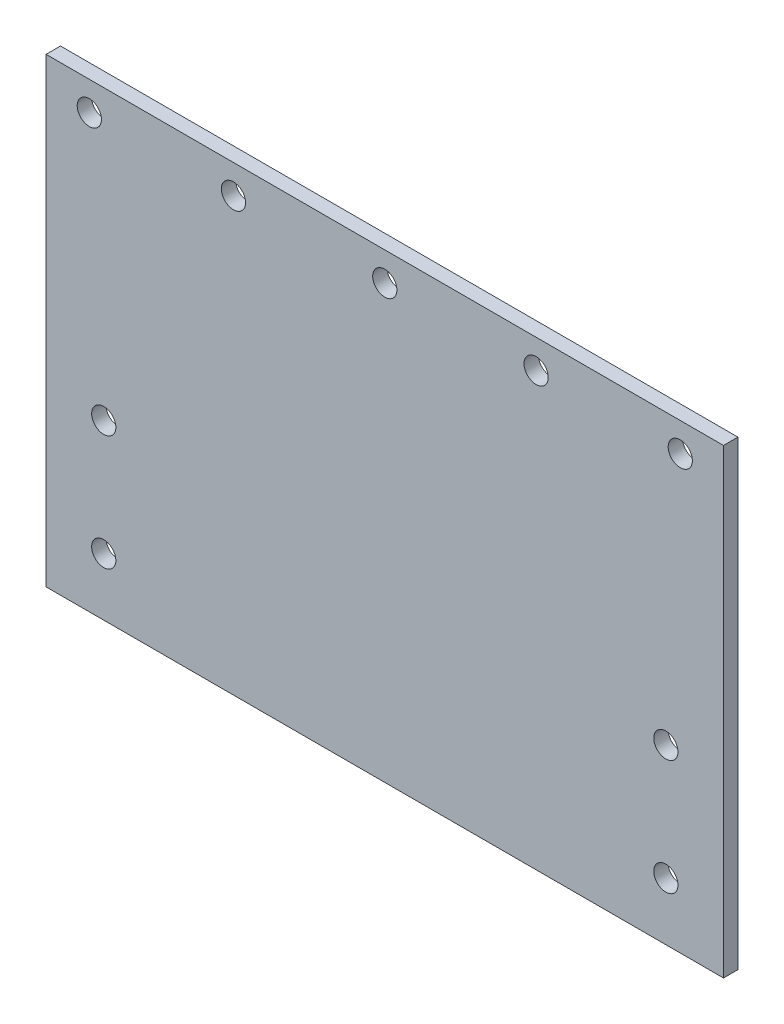
ISO-10303-21;
HEADER;
FILE_DESCRIPTION(('STEP AP214'),'2;1');
FILE_NAME('part.step','',(''),(''),'','','');
FILE_SCHEMA(('AUTOMOTIVE_DESIGN { 1 0 10303 214 1 1 1 1 }'));
ENDSEC;
DATA;
#1=APPLICATION_CONTEXT('core data for automotive mechanical design processes');
#2=APPLICATION_PROTOCOL_DEFINITION('international standard','automotive_design',2000,#1);
#3=PRODUCT_CONTEXT('',#1,'mechanical');
#4=PRODUCT('Part','Part','',(#3));
#5=PRODUCT_RELATED_PRODUCT_CATEGORY('part','',(#4));
#6=PRODUCT_DEFINITION_FORMATION('','',#4);
#7=PRODUCT_DEFINITION_CONTEXT('part definition',#1,'design');
#8=PRODUCT_DEFINITION('design','',#6,#7);
#9=PRODUCT_DEFINITION_SHAPE('','',#8);
#10=(LENGTH_UNIT() NAMED_UNIT(*) SI_UNIT(.MILLI.,.METRE.));
#11=(NAMED_UNIT(*) PLANE_ANGLE_UNIT() SI_UNIT($,.RADIAN.));
#12=(NAMED_UNIT(*) SI_UNIT($,.STERADIAN.) SOLID_ANGLE_UNIT());
#13=UNCERTAINTY_MEASURE_WITH_UNIT(LENGTH_MEASURE(1.E-05),#10,'distance_accuracy_value','');
#14=(GEOMETRIC_REPRESENTATION_CONTEXT(3) GLOBAL_UNCERTAINTY_ASSIGNED_CONTEXT((#13)) GLOBAL_UNIT_ASSIGNED_CONTEXT((#10,
#11,#12)) REPRESENTATION_CONTEXT('',''));
#15=CARTESIAN_POINT('',(0.,0.,0.));
#16=DIRECTION('',(0.,0.,1.));
#17=DIRECTION('',(1.,0.,0.));
#18=AXIS2_PLACEMENT_3D('',#15,#16,#17);
#19=CARTESIAN_POINT('',(-117.5,-80.,5.));
#20=DIRECTION('',(1.,0.,0.));
#21=DIRECTION('',(0.,0.,-1.));
#22=AXIS2_PLACEMENT_3D('',#19,#20,#21);
#23=PLANE('',#22);
#24=DIRECTION('',(0.,-1.,0.));
#25=VECTOR('',#24,1.);
#26=CARTESIAN_POINT('',(-117.5,-80.,0.));
#27=LINE('',#26,#25);
#28=CARTESIAN_POINT('',(-117.5,80.,0.));
#29=VERTEX_POINT('',#28);
#30=CARTESIAN_POINT('',(-117.5,-80.,0.));
#31=VERTEX_POINT('',#30);
#32=EDGE_CURVE('E111',#29,#31,#27,.T.);
#33=ORIENTED_EDGE('',*,*,#32,.T.);
#34=DIRECTION('',(0.,0.,-1.));
#35=VECTOR('',#34,1.);
#36=CARTESIAN_POINT('',(-117.5,-80.,5.));
#37=LINE('',#36,#35);
#38=CARTESIAN_POINT('',(-117.5,-80.,5.));
#39=VERTEX_POINT('',#38);
#40=EDGE_CURVE('E11',#39,#31,#37,.T.);
#41=ORIENTED_EDGE('',*,*,#40,.F.);
#42=DIRECTION('',(0.,-1.,0.));
#43=VECTOR('',#42,1.);
#44=CARTESIAN_POINT('',(-117.5,-80.,5.));
#45=LINE('',#44,#43);
#46=CARTESIAN_POINT('',(-117.5,80.,5.));
#47=VERTEX_POINT('',#46);
#48=EDGE_CURVE('E95',#47,#39,#45,.T.);
#49=ORIENTED_EDGE('',*,*,#48,.F.);
#50=DIRECTION('',(0.,0.,-1.));
#51=VECTOR('',#50,1.);
#52=CARTESIAN_POINT('',(-117.5,80.,5.));
#53=LINE('',#52,#51);
#54=EDGE_CURVE('E107',#47,#29,#53,.T.);
#55=ORIENTED_EDGE('',*,*,#54,.T.);
#56=EDGE_LOOP('',(#33,#41,#49,#55));
#57=FACE_BOUND('',#56,.T.);
#58=ADVANCED_FACE('F43',(#57),#23,.F.);
#59=CARTESIAN_POINT('',(117.5,-80.,5.));
#60=DIRECTION('',(0.,1.,0.));
#61=DIRECTION('',(-1.,0.,0.));
#62=AXIS2_PLACEMENT_3D('',#59,#60,#61);
#63=PLANE('',#62);
#64=DIRECTION('',(1.,0.,0.));
#65=VECTOR('',#64,1.);
#66=CARTESIAN_POINT('',(117.5,-80.,0.));
#67=LINE('',#66,#65);
#68=CARTESIAN_POINT('',(117.5,-80.,0.));
#69=VERTEX_POINT('',#68);
#70=EDGE_CURVE('E100',#31,#69,#67,.T.);
#71=ORIENTED_EDGE('',*,*,#70,.T.);
#72=DIRECTION('',(0.,0.,-1.));
#73=VECTOR('',#72,1.);
#74=CARTESIAN_POINT('',(117.5,-80.,5.));
#75=LINE('',#74,#73);
#76=CARTESIAN_POINT('',(117.5,-80.,5.));
#77=VERTEX_POINT('',#76);
#78=EDGE_CURVE('E52',#77,#69,#75,.T.);
#79=ORIENTED_EDGE('',*,*,#78,.F.);
#80=DIRECTION('',(1.,0.,0.));
#81=VECTOR('',#80,1.);
#82=CARTESIAN_POINT('',(117.5,-80.,5.));
#83=LINE('',#82,#81);
#84=EDGE_CURVE('E90',#39,#77,#83,.T.);
#85=ORIENTED_EDGE('',*,*,#84,.F.);
#86=ORIENTED_EDGE('',*,*,#40,.T.);
#87=EDGE_LOOP('',(#71,#79,#85,#86));
#88=FACE_BOUND('',#87,.T.);
#89=ADVANCED_FACE('F99',(#88),#63,.F.);
#90=CARTESIAN_POINT('',(117.5,-80.,5.));
#91=DIRECTION('',(-1.,0.,0.));
#92=DIRECTION('',(0.,0.,1.));
#93=AXIS2_PLACEMENT_3D('',#90,#91,#92);
#94=PLANE('',#93);
#95=DIRECTION('',(0.,1.,0.));
#96=VECTOR('',#95,1.);
#97=CARTESIAN_POINT('',(117.5,-80.,0.));
#98=LINE('',#97,#96);
#99=CARTESIAN_POINT('',(117.5,80.,0.));
#100=VERTEX_POINT('',#99);
#101=EDGE_CURVE('E77',#69,#100,#98,.T.);
#102=ORIENTED_EDGE('',*,*,#101,.T.);
#103=DIRECTION('',(0.,0.,-1.));
#104=VECTOR('',#103,1.);
#105=CARTESIAN_POINT('',(117.5,80.,5.));
#106=LINE('',#105,#104);
#107=CARTESIAN_POINT('',(117.5,80.,5.));
#108=VERTEX_POINT('',#107);
#109=EDGE_CURVE('E102',#108,#100,#106,.T.);
#110=ORIENTED_EDGE('',*,*,#109,.F.);
#111=DIRECTION('',(0.,1.,0.));
#112=VECTOR('',#111,1.);
#113=CARTESIAN_POINT('',(117.5,-80.,5.));
#114=LINE('',#113,#112);
#115=EDGE_CURVE('E93',#77,#108,#114,.T.);
#116=ORIENTED_EDGE('',*,*,#115,.F.);
#117=ORIENTED_EDGE('',*,*,#78,.T.);
#118=EDGE_LOOP('',(#102,#110,#116,#117));
#119=FACE_BOUND('',#118,.T.);
#120=ADVANCED_FACE('F103',(#119),#94,.F.);
#121=CARTESIAN_POINT('',(117.5,80.,5.));
#122=DIRECTION('',(0.,-1.,0.));
#123=DIRECTION('',(1.,0.,0.));
#124=AXIS2_PLACEMENT_3D('',#121,#122,#123);
#125=PLANE('',#124);
#126=DIRECTION('',(-1.,0.,0.));
#127=VECTOR('',#126,1.);
#128=CARTESIAN_POINT('',(117.5,80.,0.));
#129=LINE('',#128,#127);
#130=EDGE_CURVE('E83',#100,#29,#129,.T.);
#131=ORIENTED_EDGE('',*,*,#130,.T.);
#132=ORIENTED_EDGE('',*,*,#54,.F.);
#133=DIRECTION('',(-1.,0.,0.));
#134=VECTOR('',#133,1.);
#135=CARTESIAN_POINT('',(117.5,80.,5.));
#136=LINE('',#135,#134);
#137=EDGE_CURVE('E60',#108,#47,#136,.T.);
#138=ORIENTED_EDGE('',*,*,#137,.F.);
#139=ORIENTED_EDGE('',*,*,#109,.T.);
#140=EDGE_LOOP('',(#131,#132,#138,#139));
#141=FACE_BOUND('',#140,.T.);
#142=ADVANCED_FACE('F125',(#141),#125,.F.);
#143=CARTESIAN_POINT('',(0.,0.,5.));
#144=DIRECTION('',(0.,0.,1.));
#145=DIRECTION('',(1.,0.,0.));
#146=AXIS2_PLACEMENT_3D('',#143,#144,#145);
#147=PLANE('',#146);
#148=CARTESIAN_POINT('',(-102.5,70.,5.));
#149=DIRECTION('',(0.,0.,1.));
#150=DIRECTION('',(1.,0.,0.));
#151=AXIS2_PLACEMENT_3D('',#148,#149,#150);
#152=CIRCLE('',#151,4.19999999999998);
#153=CARTESIAN_POINT('',(-98.3,70.,5.));
#154=VERTEX_POINT('',#153);
#155=EDGE_CURVE('E199',#154,#154,#152,.T.);
#156=ORIENTED_EDGE('',*,*,#155,.F.);
#157=EDGE_LOOP('',(#156));
#158=FACE_BOUND('',#157,.T.);
#159=CARTESIAN_POINT('',(-97.5,-20.,5.));
#160=DIRECTION('',(0.,0.,1.));
#161=DIRECTION('',(1.,0.,0.));
#162=AXIS2_PLACEMENT_3D('',#159,#160,#161);
#163=CIRCLE('',#162,4.2);
#164=CARTESIAN_POINT('',(-93.3,-20.,5.));
#165=VERTEX_POINT('',#164);
#166=EDGE_CURVE('E191',#165,#165,#163,.T.);
#167=ORIENTED_EDGE('',*,*,#166,.F.);
#168=EDGE_LOOP('',(#167));
#169=FACE_BOUND('',#168,.T.);
#170=CARTESIAN_POINT('',(-97.5,-60.,5.));
#171=DIRECTION('',(0.,0.,1.));
#172=DIRECTION('',(1.,0.,0.));
#173=AXIS2_PLACEMENT_3D('',#170,#171,#172);
#174=CIRCLE('',#173,4.2);
#175=CARTESIAN_POINT('',(-93.3,-60.,5.));
#176=VERTEX_POINT('',#175);
#177=EDGE_CURVE('E183',#176,#176,#174,.T.);
#178=ORIENTED_EDGE('',*,*,#177,.F.);
#179=EDGE_LOOP('',(#178));
#180=FACE_BOUND('',#179,.T.);
#181=CARTESIAN_POINT('',(-52.5,70.,5.));
#182=DIRECTION('',(0.,0.,1.));
#183=DIRECTION('',(1.,0.,0.));
#184=AXIS2_PLACEMENT_3D('',#181,#182,#183);
#185=CIRCLE('',#184,4.19999999999999);
#186=CARTESIAN_POINT('',(-48.3,70.,5.));
#187=VERTEX_POINT('',#186);
#188=EDGE_CURVE('E175',#187,#187,#185,.T.);
#189=ORIENTED_EDGE('',*,*,#188,.F.);
#190=EDGE_LOOP('',(#189));
#191=FACE_BOUND('',#190,.T.);
#192=CARTESIAN_POINT('',(0.,70.,5.));
#193=DIRECTION('',(0.,0.,1.));
#194=DIRECTION('',(1.,0.,0.));
#195=AXIS2_PLACEMENT_3D('',#192,#193,#194);
#196=CIRCLE('',#195,4.19999999999999);
#197=CARTESIAN_POINT('',(4.19999999999999,70.,5.));
#198=VERTEX_POINT('',#197);
#199=EDGE_CURVE('E167',#198,#198,#196,.T.);
#200=ORIENTED_EDGE('',*,*,#199,.F.);
#201=EDGE_LOOP('',(#200));
#202=FACE_BOUND('',#201,.T.);
#203=CARTESIAN_POINT('',(52.5,70.,5.));
#204=DIRECTION('',(0.,0.,1.));
#205=DIRECTION('',(1.,0.,0.));
#206=AXIS2_PLACEMENT_3D('',#203,#204,#205);
#207=CIRCLE('',#206,4.19999999999999);
#208=CARTESIAN_POINT('',(56.7,70.,5.));
#209=VERTEX_POINT('',#208);
#210=EDGE_CURVE('E159',#209,#209,#207,.T.);
#211=ORIENTED_EDGE('',*,*,#210,.F.);
#212=EDGE_LOOP('',(#211));
#213=FACE_BOUND('',#212,.T.);
#214=CARTESIAN_POINT('',(102.5,70.,5.));
#215=DIRECTION('',(0.,0.,1.));
#216=DIRECTION('',(1.,0.,0.));
#217=AXIS2_PLACEMENT_3D('',#214,#215,#216);
#218=CIRCLE('',#217,4.19999999999998);
#219=CARTESIAN_POINT('',(106.7,70.,5.));
#220=VERTEX_POINT('',#219);
#221=EDGE_CURVE('E151',#220,#220,#218,.T.);
#222=ORIENTED_EDGE('',*,*,#221,.F.);
#223=EDGE_LOOP('',(#222));
#224=FACE_BOUND('',#223,.T.);
#225=CARTESIAN_POINT('',(97.5,-20.,5.));
#226=DIRECTION('',(0.,0.,1.));
#227=DIRECTION('',(1.,0.,0.));
#228=AXIS2_PLACEMENT_3D('',#225,#226,#227);
#229=CIRCLE('',#228,4.2);
#230=CARTESIAN_POINT('',(101.7,-20.,5.));
#231=VERTEX_POINT('',#230);
#232=EDGE_CURVE('E143',#231,#231,#229,.T.);
#233=ORIENTED_EDGE('',*,*,#232,.F.);
#234=EDGE_LOOP('',(#233));
#235=FACE_BOUND('',#234,.T.);
#236=CARTESIAN_POINT('',(97.5,-60.,5.));
#237=DIRECTION('',(0.,0.,1.));
#238=DIRECTION('',(1.,0.,0.));
#239=AXIS2_PLACEMENT_3D('',#236,#237,#238);
#240=CIRCLE('',#239,4.2);
#241=CARTESIAN_POINT('',(101.7,-60.,5.));
#242=VERTEX_POINT('',#241);
#243=EDGE_CURVE('E135',#242,#242,#240,.T.);
#244=ORIENTED_EDGE('',*,*,#243,.F.);
#245=EDGE_LOOP('',(#244));
#246=FACE_BOUND('',#245,.T.);
#247=ORIENTED_EDGE('',*,*,#48,.T.);
#248=ORIENTED_EDGE('',*,*,#84,.T.);
#249=ORIENTED_EDGE('',*,*,#115,.T.);
#250=ORIENTED_EDGE('',*,*,#137,.T.);
#251=EDGE_LOOP('',(#247,#248,#249,#250));
#252=FACE_BOUND('',#251,.T.);
#253=ADVANCED_FACE('F91',(#158,#169,#180,#191,#202,#213,#224,#235,#246,#252),#147,.T.);
#254=CARTESIAN_POINT('',(0.,0.,0.));
#255=DIRECTION('',(0.,0.,1.));
#256=DIRECTION('',(1.,0.,0.));
#257=AXIS2_PLACEMENT_3D('',#254,#255,#256);
#258=PLANE('',#257);
#259=CARTESIAN_POINT('',(-102.5,70.,0.));
#260=DIRECTION('',(0.,0.,1.));
#261=DIRECTION('',(1.,0.,0.));
#262=AXIS2_PLACEMENT_3D('',#259,#260,#261);
#263=CIRCLE('',#262,4.2);
#264=CARTESIAN_POINT('',(-98.3,70.,0.));
#265=VERTEX_POINT('',#264);
#266=EDGE_CURVE('E195',#265,#265,#263,.T.);
#267=ORIENTED_EDGE('',*,*,#266,.T.);
#268=EDGE_LOOP('',(#267));
#269=FACE_BOUND('',#268,.T.);
#270=CARTESIAN_POINT('',(-97.5,-20.,0.));
#271=DIRECTION('',(0.,0.,1.));
#272=DIRECTION('',(1.,0.,0.));
#273=AXIS2_PLACEMENT_3D('',#270,#271,#272);
#274=CIRCLE('',#273,4.2);
#275=CARTESIAN_POINT('',(-93.3,-20.,0.));
#276=VERTEX_POINT('',#275);
#277=EDGE_CURVE('E187',#276,#276,#274,.T.);
#278=ORIENTED_EDGE('',*,*,#277,.T.);
#279=EDGE_LOOP('',(#278));
#280=FACE_BOUND('',#279,.T.);
#281=CARTESIAN_POINT('',(-97.5,-60.,0.));
#282=DIRECTION('',(0.,0.,1.));
#283=DIRECTION('',(1.,0.,0.));
#284=AXIS2_PLACEMENT_3D('',#281,#282,#283);
#285=CIRCLE('',#284,4.2);
#286=CARTESIAN_POINT('',(-93.3,-60.,0.));
#287=VERTEX_POINT('',#286);
#288=EDGE_CURVE('E179',#287,#287,#285,.T.);
#289=ORIENTED_EDGE('',*,*,#288,.T.);
#290=EDGE_LOOP('',(#289));
#291=FACE_BOUND('',#290,.T.);
#292=CARTESIAN_POINT('',(-52.5,70.,0.));
#293=DIRECTION('',(0.,0.,1.));
#294=DIRECTION('',(1.,0.,0.));
#295=AXIS2_PLACEMENT_3D('',#292,#293,#294);
#296=CIRCLE('',#295,4.2);
#297=CARTESIAN_POINT('',(-48.3,70.,0.));
#298=VERTEX_POINT('',#297);
#299=EDGE_CURVE('E171',#298,#298,#296,.T.);
#300=ORIENTED_EDGE('',*,*,#299,.T.);
#301=EDGE_LOOP('',(#300));
#302=FACE_BOUND('',#301,.T.);
#303=CARTESIAN_POINT('',(0.,70.,0.));
#304=DIRECTION('',(0.,0.,1.));
#305=DIRECTION('',(1.,0.,0.));
#306=AXIS2_PLACEMENT_3D('',#303,#304,#305);
#307=CIRCLE('',#306,4.2);
#308=CARTESIAN_POINT('',(4.2,70.,0.));
#309=VERTEX_POINT('',#308);
#310=EDGE_CURVE('E163',#309,#309,#307,.T.);
#311=ORIENTED_EDGE('',*,*,#310,.T.);
#312=EDGE_LOOP('',(#311));
#313=FACE_BOUND('',#312,.T.);
#314=CARTESIAN_POINT('',(52.5,70.,0.));
#315=DIRECTION('',(0.,0.,1.));
#316=DIRECTION('',(1.,0.,0.));
#317=AXIS2_PLACEMENT_3D('',#314,#315,#316);
#318=CIRCLE('',#317,4.2);
#319=CARTESIAN_POINT('',(56.7,70.,0.));
#320=VERTEX_POINT('',#319);
#321=EDGE_CURVE('E155',#320,#320,#318,.T.);
#322=ORIENTED_EDGE('',*,*,#321,.T.);
#323=EDGE_LOOP('',(#322));
#324=FACE_BOUND('',#323,.T.);
#325=CARTESIAN_POINT('',(102.5,70.,0.));
#326=DIRECTION('',(0.,0.,1.));
#327=DIRECTION('',(1.,0.,0.));
#328=AXIS2_PLACEMENT_3D('',#325,#326,#327);
#329=CIRCLE('',#328,4.2);
#330=CARTESIAN_POINT('',(106.7,70.,0.));
#331=VERTEX_POINT('',#330);
#332=EDGE_CURVE('E147',#331,#331,#329,.T.);
#333=ORIENTED_EDGE('',*,*,#332,.T.);
#334=EDGE_LOOP('',(#333));
#335=FACE_BOUND('',#334,.T.);
#336=CARTESIAN_POINT('',(97.5,-20.,0.));
#337=DIRECTION('',(0.,0.,1.));
#338=DIRECTION('',(1.,0.,0.));
#339=AXIS2_PLACEMENT_3D('',#336,#337,#338);
#340=CIRCLE('',#339,4.2);
#341=CARTESIAN_POINT('',(101.7,-20.,0.));
#342=VERTEX_POINT('',#341);
#343=EDGE_CURVE('E139',#342,#342,#340,.T.);
#344=ORIENTED_EDGE('',*,*,#343,.T.);
#345=EDGE_LOOP('',(#344));
#346=FACE_BOUND('',#345,.T.);
#347=CARTESIAN_POINT('',(97.5,-60.,0.));
#348=DIRECTION('',(0.,0.,1.));
#349=DIRECTION('',(1.,0.,0.));
#350=AXIS2_PLACEMENT_3D('',#347,#348,#349);
#351=CIRCLE('',#350,4.2);
#352=CARTESIAN_POINT('',(101.7,-60.,0.));
#353=VERTEX_POINT('',#352);
#354=EDGE_CURVE('E115',#353,#353,#351,.T.);
#355=ORIENTED_EDGE('',*,*,#354,.T.);
#356=EDGE_LOOP('',(#355));
#357=FACE_BOUND('',#356,.T.);
#358=ORIENTED_EDGE('',*,*,#32,.F.);
#359=ORIENTED_EDGE('',*,*,#130,.F.);
#360=ORIENTED_EDGE('',*,*,#101,.F.);
#361=ORIENTED_EDGE('',*,*,#70,.F.);
#362=EDGE_LOOP('',(#358,#359,#360,#361));
#363=FACE_BOUND('',#362,.T.);
#364=ADVANCED_FACE('F128',(#269,#280,#291,#302,#313,#324,#335,#346,#357,#363),#258,.F.);
#365=CARTESIAN_POINT('',(97.5,-60.,5.));
#366=DIRECTION('',(0.,0.,1.));
#367=DIRECTION('',(1.,0.,0.));
#368=AXIS2_PLACEMENT_3D('',#365,#366,#367);
#369=CYLINDRICAL_SURFACE('',#368,4.2);
#370=ORIENTED_EDGE('',*,*,#354,.F.);
#371=EDGE_LOOP('',(#370));
#372=FACE_BOUND('',#371,.T.);
#373=ORIENTED_EDGE('',*,*,#243,.T.);
#374=EDGE_LOOP('',(#373));
#375=FACE_BOUND('',#374,.T.);
#376=ADVANCED_FACE('F225',(#372,#375),#369,.F.);
#377=CARTESIAN_POINT('',(97.5,-20.,5.));
#378=DIRECTION('',(0.,0.,1.));
#379=DIRECTION('',(1.,0.,0.));
#380=AXIS2_PLACEMENT_3D('',#377,#378,#379);
#381=CYLINDRICAL_SURFACE('',#380,4.2);
#382=ORIENTED_EDGE('',*,*,#343,.F.);
#383=EDGE_LOOP('',(#382));
#384=FACE_BOUND('',#383,.T.);
#385=ORIENTED_EDGE('',*,*,#232,.T.);
#386=EDGE_LOOP('',(#385));
#387=FACE_BOUND('',#386,.T.);
#388=ADVANCED_FACE('F227',(#384,#387),#381,.F.);
#389=CARTESIAN_POINT('',(102.5,70.,5.));
#390=DIRECTION('',(0.,0.,1.));
#391=DIRECTION('',(1.,0.,0.));
#392=AXIS2_PLACEMENT_3D('',#389,#390,#391);
#393=CYLINDRICAL_SURFACE('',#392,4.19999999999999);
#394=ORIENTED_EDGE('',*,*,#332,.F.);
#395=EDGE_LOOP('',(#394));
#396=FACE_BOUND('',#395,.T.);
#397=ORIENTED_EDGE('',*,*,#221,.T.);
#398=EDGE_LOOP('',(#397));
#399=FACE_BOUND('',#398,.T.);
#400=ADVANCED_FACE('F234',(#396,#399),#393,.F.);
#401=CARTESIAN_POINT('',(52.5,70.,5.));
#402=DIRECTION('',(0.,0.,1.));
#403=DIRECTION('',(1.,0.,0.));
#404=AXIS2_PLACEMENT_3D('',#401,#402,#403);
#405=CYLINDRICAL_SURFACE('',#404,4.19999999999999);
#406=ORIENTED_EDGE('',*,*,#321,.F.);
#407=EDGE_LOOP('',(#406));
#408=FACE_BOUND('',#407,.T.);
#409=ORIENTED_EDGE('',*,*,#210,.T.);
#410=EDGE_LOOP('',(#409));
#411=FACE_BOUND('',#410,.T.);
#412=ADVANCED_FACE('F284',(#408,#411),#405,.F.);
#413=CARTESIAN_POINT('',(0.,70.,5.));
#414=DIRECTION('',(0.,0.,1.));
#415=DIRECTION('',(1.,0.,0.));
#416=AXIS2_PLACEMENT_3D('',#413,#414,#415);
#417=CYLINDRICAL_SURFACE('',#416,4.19999999999999);
#418=ORIENTED_EDGE('',*,*,#310,.F.);
#419=EDGE_LOOP('',(#418));
#420=FACE_BOUND('',#419,.T.);
#421=ORIENTED_EDGE('',*,*,#199,.T.);
#422=EDGE_LOOP('',(#421));
#423=FACE_BOUND('',#422,.T.);
#424=ADVANCED_FACE('F295',(#420,#423),#417,.F.);
#425=CARTESIAN_POINT('',(-52.5,70.,5.));
#426=DIRECTION('',(0.,0.,1.));
#427=DIRECTION('',(1.,0.,0.));
#428=AXIS2_PLACEMENT_3D('',#425,#426,#427);
#429=CYLINDRICAL_SURFACE('',#428,4.19999999999999);
#430=ORIENTED_EDGE('',*,*,#299,.F.);
#431=EDGE_LOOP('',(#430));
#432=FACE_BOUND('',#431,.T.);
#433=ORIENTED_EDGE('',*,*,#188,.T.);
#434=EDGE_LOOP('',(#433));
#435=FACE_BOUND('',#434,.T.);
#436=ADVANCED_FACE('F306',(#432,#435),#429,.F.);
#437=CARTESIAN_POINT('',(-97.5,-60.,5.));
#438=DIRECTION('',(0.,0.,1.));
#439=DIRECTION('',(1.,0.,0.));
#440=AXIS2_PLACEMENT_3D('',#437,#438,#439);
#441=CYLINDRICAL_SURFACE('',#440,4.2);
#442=ORIENTED_EDGE('',*,*,#288,.F.);
#443=EDGE_LOOP('',(#442));
#444=FACE_BOUND('',#443,.T.);
#445=ORIENTED_EDGE('',*,*,#177,.T.);
#446=EDGE_LOOP('',(#445));
#447=FACE_BOUND('',#446,.T.);
#448=ADVANCED_FACE('F317',(#444,#447),#441,.F.);
#449=CARTESIAN_POINT('',(-97.5,-20.,5.));
#450=DIRECTION('',(0.,0.,1.));
#451=DIRECTION('',(1.,0.,0.));
#452=AXIS2_PLACEMENT_3D('',#449,#450,#451);
#453=CYLINDRICAL_SURFACE('',#452,4.2);
#454=ORIENTED_EDGE('',*,*,#277,.F.);
#455=EDGE_LOOP('',(#454));
#456=FACE_BOUND('',#455,.T.);
#457=ORIENTED_EDGE('',*,*,#166,.T.);
#458=EDGE_LOOP('',(#457));
#459=FACE_BOUND('',#458,.T.);
#460=ADVANCED_FACE('F328',(#456,#459),#453,.F.);
#461=CARTESIAN_POINT('',(-102.5,70.,5.));
#462=DIRECTION('',(0.,0.,1.));
#463=DIRECTION('',(1.,0.,0.));
#464=AXIS2_PLACEMENT_3D('',#461,#462,#463);
#465=CYLINDRICAL_SURFACE('',#464,4.19999999999999);
#466=ORIENTED_EDGE('',*,*,#266,.F.);
#467=EDGE_LOOP('',(#466));
#468=FACE_BOUND('',#467,.T.);
#469=ORIENTED_EDGE('',*,*,#155,.T.);
#470=EDGE_LOOP('',(#469));
#471=FACE_BOUND('',#470,.T.);
#472=ADVANCED_FACE('F204',(#468,#471),#465,.F.);
#473=CLOSED_SHELL('',(#58,#89,#120,#142,#253,#364,#376,#388,#400,#412,#424,#436,#448,#460,#472));
#474=MANIFOLD_SOLID_BREP('B2',#473);
#475=ADVANCED_BREP_SHAPE_REPRESENTATION('',(#18,#474),#14);
#476=SHAPE_DEFINITION_REPRESENTATION(#9,#475);
ENDSEC;
END-ISO-10303-21;
